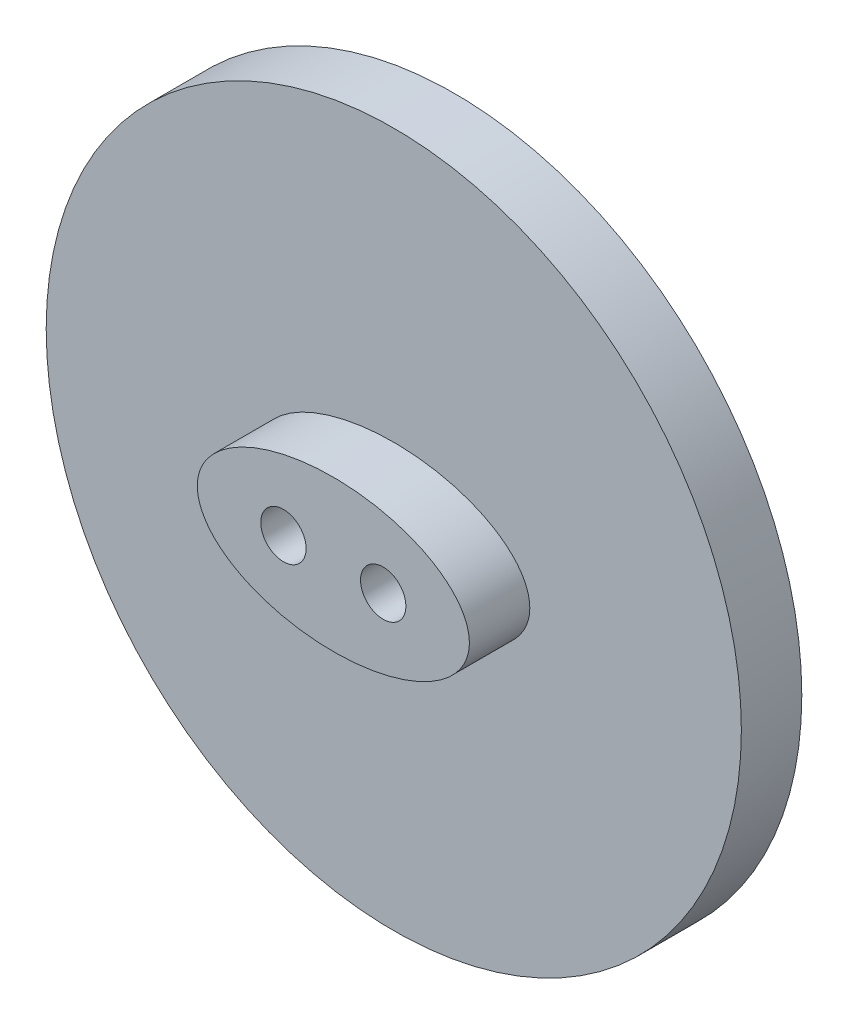
ISO-10303-21;
HEADER;
FILE_DESCRIPTION(('STEP AP214'),'2;1');
FILE_NAME('part.step','',(''),(''),'','','');
FILE_SCHEMA(('AUTOMOTIVE_DESIGN { 1 0 10303 214 1 1 1 1 }'));
ENDSEC;
DATA;
#1=APPLICATION_CONTEXT('core data for automotive mechanical design processes');
#2=APPLICATION_PROTOCOL_DEFINITION('international standard','automotive_design',2000,#1);
#3=PRODUCT_CONTEXT('',#1,'mechanical');
#4=PRODUCT('Part','Part','',(#3));
#5=PRODUCT_RELATED_PRODUCT_CATEGORY('part','',(#4));
#6=PRODUCT_DEFINITION_FORMATION('','',#4);
#7=PRODUCT_DEFINITION_CONTEXT('part definition',#1,'design');
#8=PRODUCT_DEFINITION('design','',#6,#7);
#9=PRODUCT_DEFINITION_SHAPE('','',#8);
#10=(LENGTH_UNIT() NAMED_UNIT(*) SI_UNIT(.MILLI.,.METRE.));
#11=(NAMED_UNIT(*) PLANE_ANGLE_UNIT() SI_UNIT($,.RADIAN.));
#12=(NAMED_UNIT(*) SI_UNIT($,.STERADIAN.) SOLID_ANGLE_UNIT());
#13=UNCERTAINTY_MEASURE_WITH_UNIT(LENGTH_MEASURE(1.E-05),#10,'distance_accuracy_value','');
#14=(GEOMETRIC_REPRESENTATION_CONTEXT(3) GLOBAL_UNCERTAINTY_ASSIGNED_CONTEXT((#13)) GLOBAL_UNIT_ASSIGNED_CONTEXT((#10,
#11,#12)) REPRESENTATION_CONTEXT('',''));
#15=CARTESIAN_POINT('',(0.,0.,0.));
#16=DIRECTION('',(0.,0.,1.));
#17=DIRECTION('',(1.,0.,0.));
#18=AXIS2_PLACEMENT_3D('',#15,#16,#17);
#19=CARTESIAN_POINT('',(0.,0.,2.));
#20=DIRECTION('',(0.,0.,-1.));
#21=DIRECTION('',(-1.,0.,0.));
#22=AXIS2_PLACEMENT_3D('',#19,#20,#21);
#23=CYLINDRICAL_SURFACE('',#22,11.5);
#24=CARTESIAN_POINT('',(0.,0.,2.));
#25=DIRECTION('',(0.,0.,1.));
#26=DIRECTION('',(1.,0.,0.));
#27=AXIS2_PLACEMENT_3D('',#24,#25,#26);
#28=CIRCLE('',#27,11.5);
#29=CARTESIAN_POINT('',(11.5,0.,2.));
#30=VERTEX_POINT('',#29);
#31=EDGE_CURVE('E45',#30,#30,#28,.T.);
#32=ORIENTED_EDGE('',*,*,#31,.F.);
#33=EDGE_LOOP('',(#32));
#34=FACE_BOUND('',#33,.T.);
#35=CARTESIAN_POINT('',(0.,0.,0.));
#36=DIRECTION('',(0.,0.,1.));
#37=DIRECTION('',(1.,0.,0.));
#38=AXIS2_PLACEMENT_3D('',#35,#36,#37);
#39=CIRCLE('',#38,11.5);
#40=CARTESIAN_POINT('',(11.5,0.,0.));
#41=VERTEX_POINT('',#40);
#42=EDGE_CURVE('E40',#41,#41,#39,.T.);
#43=ORIENTED_EDGE('',*,*,#42,.T.);
#44=EDGE_LOOP('',(#43));
#45=FACE_BOUND('',#44,.T.);
#46=ADVANCED_FACE('F37',(#34,#45),#23,.T.);
#47=CARTESIAN_POINT('',(0.,0.,2.));
#48=DIRECTION('',(0.,0.,1.));
#49=DIRECTION('',(1.,0.,0.));
#50=AXIS2_PLACEMENT_3D('',#47,#48,#49);
#51=PLANE('',#50);
#52=CARTESIAN_POINT('',(0.,0.,2.));
#53=DIRECTION('',(0.,0.,1.));
#54=DIRECTION('',(1.,0.,0.));
#55=AXIS2_PLACEMENT_3D('',#52,#53,#54);
#56=ELLIPSE('',#55,4.5,2.5);
#57=CARTESIAN_POINT('',(4.5,0.,2.));
#58=VERTEX_POINT('',#57);
#59=EDGE_CURVE('E10',#58,#58,#56,.T.);
#60=ORIENTED_EDGE('',*,*,#59,.F.);
#61=EDGE_LOOP('',(#60));
#62=FACE_BOUND('',#61,.T.);
#63=ORIENTED_EDGE('',*,*,#31,.T.);
#64=EDGE_LOOP('',(#63));
#65=FACE_BOUND('',#64,.T.);
#66=ADVANCED_FACE('F69',(#62,#65),#51,.T.);
#67=CARTESIAN_POINT('',(0.,0.,0.));
#68=DIRECTION('',(0.,0.,1.));
#69=DIRECTION('',(1.,0.,0.));
#70=AXIS2_PLACEMENT_3D('',#67,#68,#69);
#71=PLANE('',#70);
#72=CARTESIAN_POINT('',(-1.65046466574381,0.,0.));
#73=DIRECTION('',(0.,0.,-1.));
#74=DIRECTION('',(-1.,0.,0.));
#75=AXIS2_PLACEMENT_3D('',#72,#73,#74);
#76=CIRCLE('',#75,0.75);
#77=CARTESIAN_POINT('',(-2.40046466574381,0.,0.));
#78=VERTEX_POINT('',#77);
#79=EDGE_CURVE('E91',#78,#78,#76,.T.);
#80=ORIENTED_EDGE('',*,*,#79,.F.);
#81=EDGE_LOOP('',(#80));
#82=FACE_BOUND('',#81,.T.);
#83=CARTESIAN_POINT('',(1.65046466574381,0.,0.));
#84=DIRECTION('',(0.,0.,-1.));
#85=DIRECTION('',(-1.,0.,0.));
#86=AXIS2_PLACEMENT_3D('',#83,#84,#85);
#87=CIRCLE('',#86,0.75);
#88=CARTESIAN_POINT('',(0.900464665743811,0.,0.));
#89=VERTEX_POINT('',#88);
#90=EDGE_CURVE('E58',#89,#89,#87,.T.);
#91=ORIENTED_EDGE('',*,*,#90,.F.);
#92=EDGE_LOOP('',(#91));
#93=FACE_BOUND('',#92,.T.);
#94=ORIENTED_EDGE('',*,*,#42,.F.);
#95=EDGE_LOOP('',(#94));
#96=FACE_BOUND('',#95,.T.);
#97=ADVANCED_FACE('F66',(#82,#93,#96),#71,.F.);
#98=CARTESIAN_POINT('',(0.,0.,4.));
#99=DIRECTION('',(0.,0.,1.));
#100=DIRECTION('',(1.,0.,0.));
#101=AXIS2_PLACEMENT_3D('',#98,#99,#100);
#102=ELLIPSE('',#101,4.5,2.5);
#103=DIRECTION('',(0.,0.,-1.));
#104=VECTOR('',#103,1.);
#105=SURFACE_OF_LINEAR_EXTRUSION('',#102,#104);
#106=CARTESIAN_POINT('',(4.5,0.,4.));
#107=VERTEX_POINT('',#106);
#108=EDGE_CURVE('E52',#107,#107,#102,.T.);
#109=ORIENTED_EDGE('',*,*,#108,.F.);
#110=EDGE_LOOP('',(#109));
#111=FACE_BOUND('',#110,.T.);
#112=ORIENTED_EDGE('',*,*,#59,.T.);
#113=EDGE_LOOP('',(#112));
#114=FACE_BOUND('',#113,.T.);
#115=ADVANCED_FACE('F61',(#111,#114),#105,.F.);
#116=CARTESIAN_POINT('',(0.,0.,4.));
#117=DIRECTION('',(0.,0.,1.));
#118=DIRECTION('',(1.,0.,0.));
#119=AXIS2_PLACEMENT_3D('',#116,#117,#118);
#120=PLANE('',#119);
#121=CARTESIAN_POINT('',(-1.65046466574381,0.,4.));
#122=DIRECTION('',(0.,0.,-1.));
#123=DIRECTION('',(-1.,0.,0.));
#124=AXIS2_PLACEMENT_3D('',#121,#122,#123);
#125=CIRCLE('',#124,0.75);
#126=CARTESIAN_POINT('',(-2.40046466574381,0.,4.));
#127=VERTEX_POINT('',#126);
#128=EDGE_CURVE('E57',#127,#127,#125,.T.);
#129=ORIENTED_EDGE('',*,*,#128,.T.);
#130=EDGE_LOOP('',(#129));
#131=FACE_BOUND('',#130,.T.);
#132=CARTESIAN_POINT('',(1.65046466574381,0.,4.));
#133=DIRECTION('',(0.,0.,-1.));
#134=DIRECTION('',(-1.,0.,0.));
#135=AXIS2_PLACEMENT_3D('',#132,#133,#134);
#136=CIRCLE('',#135,0.75);
#137=CARTESIAN_POINT('',(0.900464665743811,0.,4.));
#138=VERTEX_POINT('',#137);
#139=EDGE_CURVE('E95',#138,#138,#136,.T.);
#140=ORIENTED_EDGE('',*,*,#139,.T.);
#141=EDGE_LOOP('',(#140));
#142=FACE_BOUND('',#141,.T.);
#143=ORIENTED_EDGE('',*,*,#108,.T.);
#144=EDGE_LOOP('',(#143));
#145=FACE_BOUND('',#144,.T.);
#146=ADVANCED_FACE('F65',(#131,#142,#145),#120,.T.);
#147=CARTESIAN_POINT('',(1.65046466574381,0.,4.));
#148=DIRECTION('',(0.,0.,-1.));
#149=DIRECTION('',(-1.,0.,0.));
#150=AXIS2_PLACEMENT_3D('',#147,#148,#149);
#151=CYLINDRICAL_SURFACE('',#150,0.75);
#152=ORIENTED_EDGE('',*,*,#139,.F.);
#153=EDGE_LOOP('',(#152));
#154=FACE_BOUND('',#153,.T.);
#155=ORIENTED_EDGE('',*,*,#90,.T.);
#156=EDGE_LOOP('',(#155));
#157=FACE_BOUND('',#156,.T.);
#158=ADVANCED_FACE('F102',(#154,#157),#151,.F.);
#159=CARTESIAN_POINT('',(-1.65046466574381,0.,4.));
#160=DIRECTION('',(0.,0.,-1.));
#161=DIRECTION('',(-1.,0.,0.));
#162=AXIS2_PLACEMENT_3D('',#159,#160,#161);
#163=CYLINDRICAL_SURFACE('',#162,0.75);
#164=ORIENTED_EDGE('',*,*,#128,.F.);
#165=EDGE_LOOP('',(#164));
#166=FACE_BOUND('',#165,.T.);
#167=ORIENTED_EDGE('',*,*,#79,.T.);
#168=EDGE_LOOP('',(#167));
#169=FACE_BOUND('',#168,.T.);
#170=ADVANCED_FACE('F104',(#166,#169),#163,.F.);
#171=CLOSED_SHELL('',(#46,#66,#97,#115,#146,#158,#170));
#172=MANIFOLD_SOLID_BREP('B2',#171);
#173=ADVANCED_BREP_SHAPE_REPRESENTATION('',(#18,#172),#14);
#174=SHAPE_DEFINITION_REPRESENTATION(#9,#173);
ENDSEC;
END-ISO-10303-21;
